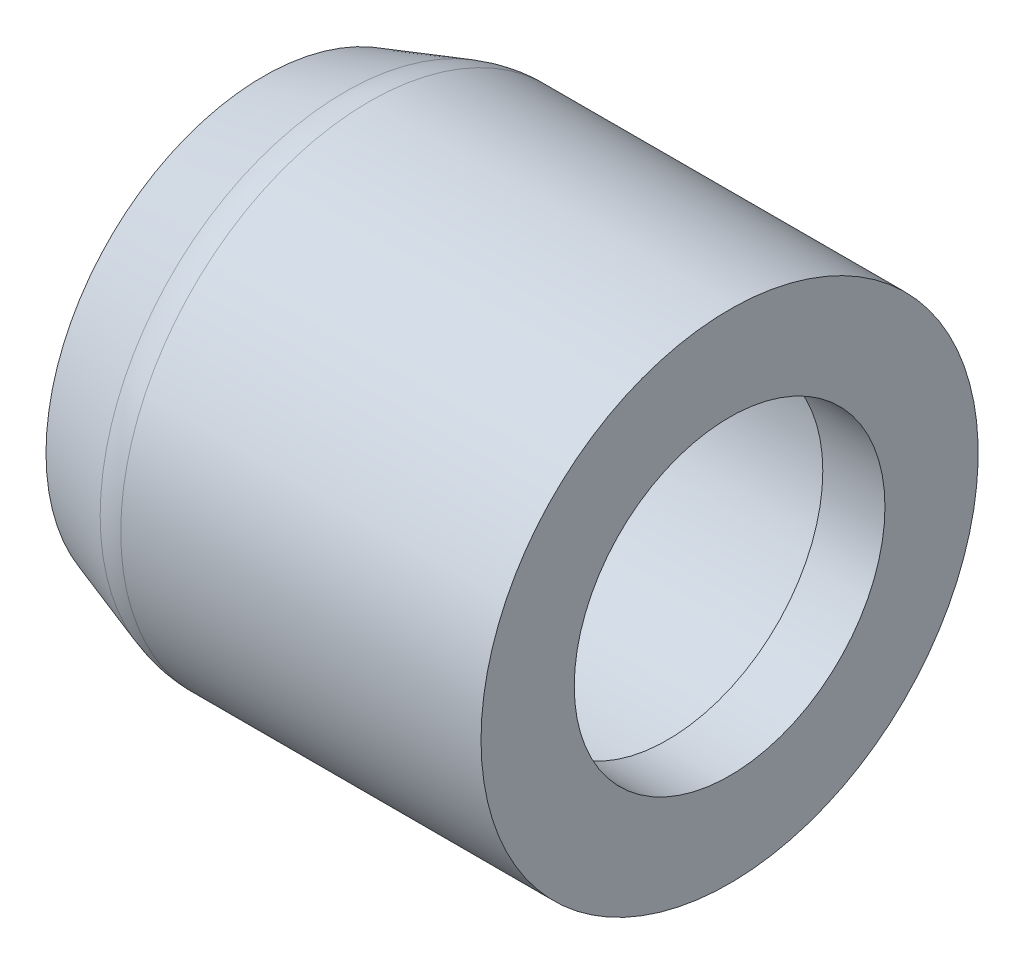
ISO-10303-21;
HEADER;
FILE_DESCRIPTION(('STEP AP214'),'2;1');
FILE_NAME('part.step','',(''),(''),'','','');
FILE_SCHEMA(('AUTOMOTIVE_DESIGN { 1 0 10303 214 1 1 1 1 }'));
ENDSEC;
DATA;
#1=APPLICATION_CONTEXT('core data for automotive mechanical design processes');
#2=APPLICATION_PROTOCOL_DEFINITION('international standard','automotive_design',2000,#1);
#3=PRODUCT_CONTEXT('',#1,'mechanical');
#4=PRODUCT('Part','Part','',(#3));
#5=PRODUCT_RELATED_PRODUCT_CATEGORY('part','',(#4));
#6=PRODUCT_DEFINITION_FORMATION('','',#4);
#7=PRODUCT_DEFINITION_CONTEXT('part definition',#1,'design');
#8=PRODUCT_DEFINITION('design','',#6,#7);
#9=PRODUCT_DEFINITION_SHAPE('','',#8);
#10=(LENGTH_UNIT() NAMED_UNIT(*) SI_UNIT(.MILLI.,.METRE.));
#11=(NAMED_UNIT(*) PLANE_ANGLE_UNIT() SI_UNIT($,.RADIAN.));
#12=(NAMED_UNIT(*) SI_UNIT($,.STERADIAN.) SOLID_ANGLE_UNIT());
#13=UNCERTAINTY_MEASURE_WITH_UNIT(LENGTH_MEASURE(1.E-05),#10,'distance_accuracy_value','');
#14=(GEOMETRIC_REPRESENTATION_CONTEXT(3) GLOBAL_UNCERTAINTY_ASSIGNED_CONTEXT((#13)) GLOBAL_UNIT_ASSIGNED_CONTEXT((#10,
#11,#12)) REPRESENTATION_CONTEXT('',''));
#15=CARTESIAN_POINT('',(0.,0.,0.));
#16=DIRECTION('',(0.,0.,1.));
#17=DIRECTION('',(1.,0.,0.));
#18=AXIS2_PLACEMENT_3D('',#15,#16,#17);
#19=CARTESIAN_POINT('',(0.,12.5,0.));
#20=DIRECTION('',(1.,0.,0.));
#21=DIRECTION('',(0.,0.,-1.));
#22=AXIS2_PLACEMENT_3D('',#19,#20,#21);
#23=PLANE('',#22);
#24=CARTESIAN_POINT('',(0.,0.,0.));
#25=DIRECTION('',(-1.,0.,0.));
#26=DIRECTION('',(0.,0.,1.));
#27=AXIS2_PLACEMENT_3D('',#24,#25,#26);
#28=CIRCLE('',#27,12.5);
#29=CARTESIAN_POINT('',(0.,0.,12.5));
#30=VERTEX_POINT('',#29);
#31=EDGE_CURVE('E42',#30,#30,#28,.T.);
#32=ORIENTED_EDGE('',*,*,#31,.F.);
#33=EDGE_LOOP('',(#32));
#34=FACE_BOUND('',#33,.T.);
#35=CARTESIAN_POINT('',(0.,0.,0.));
#36=DIRECTION('',(-1.,0.,0.));
#37=DIRECTION('',(0.,0.,1.));
#38=AXIS2_PLACEMENT_3D('',#35,#36,#37);
#39=CIRCLE('',#38,14.);
#40=CARTESIAN_POINT('',(0.,0.,14.));
#41=VERTEX_POINT('',#40);
#42=EDGE_CURVE('E60',#41,#41,#39,.T.);
#43=ORIENTED_EDGE('',*,*,#42,.T.);
#44=EDGE_LOOP('',(#43));
#45=FACE_BOUND('',#44,.T.);
#46=ADVANCED_FACE('F31',(#34,#45),#23,.F.);
#47=CARTESIAN_POINT('',(0.,0.,0.));
#48=DIRECTION('',(-1.,0.,0.));
#49=DIRECTION('',(0.,0.,1.));
#50=AXIS2_PLACEMENT_3D('',#47,#48,#49);
#51=CYLINDRICAL_SURFACE('',#50,12.5);
#52=CARTESIAN_POINT('',(26.,0.,0.));
#53=DIRECTION('',(-1.,0.,0.));
#54=DIRECTION('',(0.,0.,1.));
#55=AXIS2_PLACEMENT_3D('',#52,#53,#54);
#56=CIRCLE('',#55,12.5);
#57=CARTESIAN_POINT('',(26.,0.,12.5));
#58=VERTEX_POINT('',#57);
#59=EDGE_CURVE('E46',#58,#58,#56,.T.);
#60=ORIENTED_EDGE('',*,*,#59,.F.);
#61=EDGE_LOOP('',(#60));
#62=FACE_BOUND('',#61,.T.);
#63=ORIENTED_EDGE('',*,*,#31,.T.);
#64=EDGE_LOOP('',(#63));
#65=FACE_BOUND('',#64,.T.);
#66=ADVANCED_FACE('F77',(#62,#65),#51,.F.);
#67=CARTESIAN_POINT('',(26.,12.5,0.));
#68=DIRECTION('',(1.,0.,0.));
#69=DIRECTION('',(0.,0.,-1.));
#70=AXIS2_PLACEMENT_3D('',#67,#68,#69);
#71=PLANE('',#70);
#72=CARTESIAN_POINT('',(26.,0.,0.));
#73=DIRECTION('',(-1.,0.,0.));
#74=DIRECTION('',(0.,0.,1.));
#75=AXIS2_PLACEMENT_3D('',#72,#73,#74);
#76=CIRCLE('',#75,10.);
#77=CARTESIAN_POINT('',(26.,0.,10.));
#78=VERTEX_POINT('',#77);
#79=EDGE_CURVE('E51',#78,#78,#76,.T.);
#80=ORIENTED_EDGE('',*,*,#79,.F.);
#81=EDGE_LOOP('',(#80));
#82=FACE_BOUND('',#81,.T.);
#83=ORIENTED_EDGE('',*,*,#59,.T.);
#84=EDGE_LOOP('',(#83));
#85=FACE_BOUND('',#84,.T.);
#86=ADVANCED_FACE('F82',(#82,#85),#71,.F.);
#87=CARTESIAN_POINT('',(0.,0.,0.));
#88=DIRECTION('',(-1.,0.,0.));
#89=DIRECTION('',(0.,0.,1.));
#90=AXIS2_PLACEMENT_3D('',#87,#88,#89);
#91=CYLINDRICAL_SURFACE('',#90,10.);
#92=CARTESIAN_POINT('',(30.,0.,0.));
#93=DIRECTION('',(-1.,0.,0.));
#94=DIRECTION('',(0.,0.,1.));
#95=AXIS2_PLACEMENT_3D('',#92,#93,#94);
#96=CIRCLE('',#95,10.);
#97=CARTESIAN_POINT('',(30.,0.,10.));
#98=VERTEX_POINT('',#97);
#99=EDGE_CURVE('E54',#98,#98,#96,.T.);
#100=ORIENTED_EDGE('',*,*,#99,.F.);
#101=EDGE_LOOP('',(#100));
#102=FACE_BOUND('',#101,.T.);
#103=ORIENTED_EDGE('',*,*,#79,.T.);
#104=EDGE_LOOP('',(#103));
#105=FACE_BOUND('',#104,.T.);
#106=ADVANCED_FACE('F89',(#102,#105),#91,.F.);
#107=CARTESIAN_POINT('',(30.,10.,0.));
#108=DIRECTION('',(-1.,0.,0.));
#109=DIRECTION('',(0.,0.,1.));
#110=AXIS2_PLACEMENT_3D('',#107,#108,#109);
#111=PLANE('',#110);
#112=CARTESIAN_POINT('',(30.,0.,0.));
#113=DIRECTION('',(-1.,0.,0.));
#114=DIRECTION('',(0.,0.,1.));
#115=AXIS2_PLACEMENT_3D('',#112,#113,#114);
#116=CIRCLE('',#115,16.);
#117=CARTESIAN_POINT('',(30.,0.,16.));
#118=VERTEX_POINT('',#117);
#119=EDGE_CURVE('E57',#118,#118,#116,.T.);
#120=ORIENTED_EDGE('',*,*,#119,.F.);
#121=EDGE_LOOP('',(#120));
#122=FACE_BOUND('',#121,.T.);
#123=ORIENTED_EDGE('',*,*,#99,.T.);
#124=EDGE_LOOP('',(#123));
#125=FACE_BOUND('',#124,.T.);
#126=ADVANCED_FACE('F74',(#122,#125),#111,.F.);
#127=CARTESIAN_POINT('',(0.,0.,0.));
#128=DIRECTION('',(-1.,0.,0.));
#129=DIRECTION('',(0.,0.,1.));
#130=AXIS2_PLACEMENT_3D('',#127,#128,#129);
#131=CYLINDRICAL_SURFACE('',#130,16.);
#132=CARTESIAN_POINT('',(6.81138830084191,0.,0.));
#133=DIRECTION('',(1.,0.,0.));
#134=DIRECTION('',(0.,0.,-1.));
#135=AXIS2_PLACEMENT_3D('',#132,#133,#134);
#136=CIRCLE('',#135,16.);
#137=CARTESIAN_POINT('',(6.81138830084191,0.,-16.));
#138=VERTEX_POINT('',#137);
#139=EDGE_CURVE('E10',#138,#138,#136,.T.);
#140=ORIENTED_EDGE('',*,*,#139,.T.);
#141=EDGE_LOOP('',(#140));
#142=FACE_BOUND('',#141,.T.);
#143=ORIENTED_EDGE('',*,*,#119,.T.);
#144=EDGE_LOOP('',(#143));
#145=FACE_BOUND('',#144,.T.);
#146=ADVANCED_FACE('F67',(#142,#145),#131,.T.);
#147=CARTESIAN_POINT('',(6.,0.,0.));
#148=DIRECTION('',(1.,0.,0.));
#149=DIRECTION('',(0.,0.,-1.));
#150=AXIS2_PLACEMENT_3D('',#147,#148,#149);
#151=CONICAL_SURFACE('',#150,16.,0.321750554396642);
#152=CARTESIAN_POINT('',(5.23024947075772,0.,0.));
#153=DIRECTION('',(-1.,0.,0.));
#154=DIRECTION('',(0.,0.,1.));
#155=AXIS2_PLACEMENT_3D('',#152,#153,#154);
#156=CIRCLE('',#155,15.7434164902526);
#157=CARTESIAN_POINT('',(5.23024947075772,0.,15.7434164902526));
#158=VERTEX_POINT('',#157);
#159=EDGE_CURVE('E38',#158,#158,#156,.T.);
#160=ORIENTED_EDGE('',*,*,#159,.T.);
#161=EDGE_LOOP('',(#160));
#162=FACE_BOUND('',#161,.T.);
#163=ORIENTED_EDGE('',*,*,#42,.F.);
#164=EDGE_LOOP('',(#163));
#165=FACE_BOUND('',#164,.T.);
#166=ADVANCED_FACE('F65',(#162,#165),#151,.T.);
#167=CARTESIAN_POINT('',(6.81138830084191,0.,0.));
#168=DIRECTION('',(1.,0.,0.));
#169=DIRECTION('',(0.,0.,-1.));
#170=AXIS2_PLACEMENT_3D('',#167,#168,#169);
#171=TOROIDAL_SURFACE('',#170,11.,5.);
#172=ORIENTED_EDGE('',*,*,#139,.F.);
#173=EDGE_LOOP('',(#172));
#174=FACE_BOUND('',#173,.T.);
#175=ORIENTED_EDGE('',*,*,#159,.F.);
#176=EDGE_LOOP('',(#175));
#177=FACE_BOUND('',#176,.T.);
#178=ADVANCED_FACE('F33',(#174,#177),#171,.T.);
#179=CLOSED_SHELL('',(#46,#66,#86,#106,#126,#146,#166,#178));
#180=MANIFOLD_SOLID_BREP('B2',#179);
#181=ADVANCED_BREP_SHAPE_REPRESENTATION('',(#18,#180),#14);
#182=SHAPE_DEFINITION_REPRESENTATION(#9,#181);
ENDSEC;
END-ISO-10303-21;
